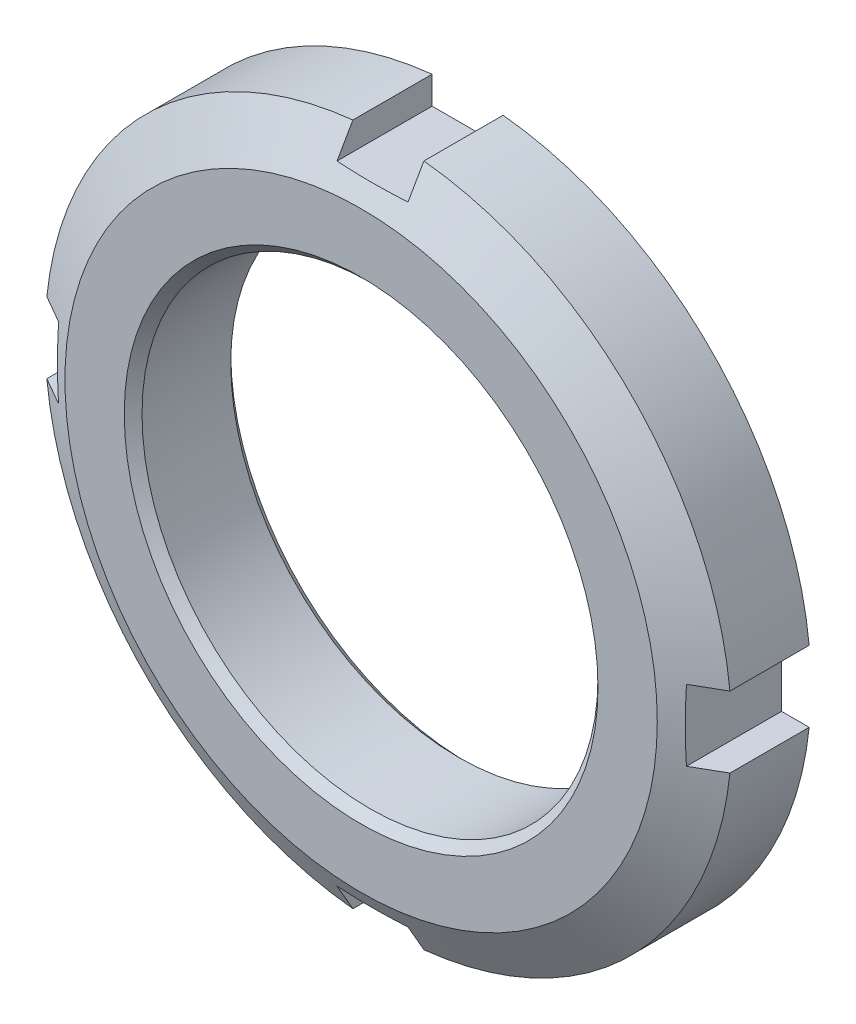
ISO-10303-21;
HEADER;
FILE_DESCRIPTION(('STEP AP214'),'2;1');
FILE_NAME('part.step','',(''),(''),'','','');
FILE_SCHEMA(('AUTOMOTIVE_DESIGN { 1 0 10303 214 1 1 1 1 }'));
ENDSEC;
DATA;
#1=APPLICATION_CONTEXT('core data for automotive mechanical design processes');
#2=APPLICATION_PROTOCOL_DEFINITION('international standard','automotive_design',2000,#1);
#3=PRODUCT_CONTEXT('',#1,'mechanical');
#4=PRODUCT('Part','Part','',(#3));
#5=PRODUCT_RELATED_PRODUCT_CATEGORY('part','',(#4));
#6=PRODUCT_DEFINITION_FORMATION('','',#4);
#7=PRODUCT_DEFINITION_CONTEXT('part definition',#1,'design');
#8=PRODUCT_DEFINITION('design','',#6,#7);
#9=PRODUCT_DEFINITION_SHAPE('','',#8);
#10=(LENGTH_UNIT() NAMED_UNIT(*) SI_UNIT(.MILLI.,.METRE.));
#11=(NAMED_UNIT(*) PLANE_ANGLE_UNIT() SI_UNIT($,.RADIAN.));
#12=(NAMED_UNIT(*) SI_UNIT($,.STERADIAN.) SOLID_ANGLE_UNIT());
#13=UNCERTAINTY_MEASURE_WITH_UNIT(LENGTH_MEASURE(1.E-05),#10,'distance_accuracy_value','');
#14=(GEOMETRIC_REPRESENTATION_CONTEXT(3) GLOBAL_UNCERTAINTY_ASSIGNED_CONTEXT((#13)) GLOBAL_UNIT_ASSIGNED_CONTEXT((#10,
#11,#12)) REPRESENTATION_CONTEXT('',''));
#15=CARTESIAN_POINT('',(0.,0.,0.));
#16=DIRECTION('',(0.,0.,1.));
#17=DIRECTION('',(1.,0.,0.));
#18=AXIS2_PLACEMENT_3D('',#15,#16,#17);
#19=CARTESIAN_POINT('',(0.,0.,7.8404212982628));
#20=DIRECTION('',(0.,0.,-1.));
#21=DIRECTION('',(-1.,0.,0.));
#22=AXIS2_PLACEMENT_3D('',#19,#20,#21);
#23=CONICAL_SURFACE('',#22,27.0002,1.0471975511966);
#24=CARTESIAN_POINT('',(2.9972,-26.5049,8.0288540819859));
#25=CARTESIAN_POINT('',(2.9972,-27.6231961592664,7.38729437410009));
#26=CARTESIAN_POINT('',(2.9972,-28.8387695120648,6.6892425965256));
#27=(BOUNDED_CURVE() B_SPLINE_CURVE(2,(#24,#25,#26),.UNSPECIFIED.,.F.,
.F.) B_SPLINE_CURVE_WITH_KNOTS((3,3),(0.,0.269100462883302),
.UNSPECIFIED.) CURVE() GEOMETRIC_REPRESENTATION_ITEM() RATIONAL_B_SPLINE_CURVE((1.,
1.00088000690833,1.)) REPRESENTATION_ITEM(''));
#28=CARTESIAN_POINT('',(2.9972,-26.5049,8.0288540819859));
#29=VERTEX_POINT('',#28);
#30=CARTESIAN_POINT('',(2.9972,-28.8387695120648,6.6892425965256));
#31=VERTEX_POINT('',#30);
#32=EDGE_CURVE('E220',#29,#31,#27,.T.);
#33=ORIENTED_EDGE('',*,*,#32,.T.);
#34=CARTESIAN_POINT('',(0.,0.,6.6892425965256));
#35=DIRECTION('',(0.,0.,-1.));
#36=DIRECTION('',(-1.,0.,0.));
#37=AXIS2_PLACEMENT_3D('',#34,#35,#36);
#38=CIRCLE('',#37,28.9941);
#39=CARTESIAN_POINT('',(28.8387695120648,-2.9972,6.6892425965256));
#40=VERTEX_POINT('',#39);
#41=EDGE_CURVE('E215',#40,#31,#38,.T.);
#42=ORIENTED_EDGE('',*,*,#41,.F.);
#43=CARTESIAN_POINT('',(28.8387695120648,-2.9972,6.6892425965256));
#44=CARTESIAN_POINT('',(27.6231961589663,-2.99720000000001,7.38729437427234));
#45=CARTESIAN_POINT('',(26.5049,-2.9972,8.0288540819859));
#46=(BOUNDED_CURVE() B_SPLINE_CURVE(2,(#43,#44,#45),.UNSPECIFIED.,.F.,
.F.) B_SPLINE_CURVE_WITH_KNOTS((3,3),(0.,0.269100462883301),
.UNSPECIFIED.) CURVE() GEOMETRIC_REPRESENTATION_ITEM() RATIONAL_B_SPLINE_CURVE((1.,
1.00088000691499,1.)) REPRESENTATION_ITEM(''));
#47=CARTESIAN_POINT('',(26.5049,-2.9972,8.0288540819859));
#48=VERTEX_POINT('',#47);
#49=EDGE_CURVE('E219',#40,#48,#46,.T.);
#50=ORIENTED_EDGE('',*,*,#49,.T.);
#51=CARTESIAN_POINT('',(26.5049,-2.99720000000001,8.0288540819859));
#52=CARTESIAN_POINT('',(26.5049000000001,-1.49383962311759,8.12638288659241));
#53=CARTESIAN_POINT('',(26.5049000000001,0.,8.12638288659242));
#54=(BOUNDED_CURVE() B_SPLINE_CURVE(2,(#51,#52,#53),.UNSPECIFIED.,.F.,
.F.) B_SPLINE_CURVE_WITH_KNOTS((3,3),(0.868990916603117,1.18411774335719),
.UNSPECIFIED.) CURVE() GEOMETRIC_REPRESENTATION_ITEM() RATIONAL_B_SPLINE_CURVE((1.04363164333091,
1.0469573550551,1.0469573550551)) REPRESENTATION_ITEM(''));
#55=CARTESIAN_POINT('',(26.5049,0.,8.12638288659242));
#56=VERTEX_POINT('',#55);
#57=EDGE_CURVE('E323',#48,#56,#54,.T.);
#58=ORIENTED_EDGE('',*,*,#57,.T.);
#59=DIRECTION('',(-0.866025403784438,0.,0.5));
#60=VECTOR('',#59,1.);
#61=CARTESIAN_POINT('',(27.0002,0.,7.84042129826279));
#62=LINE('',#61,#60);
#63=CARTESIAN_POINT('',(25.0063,0.,8.9916));
#64=VERTEX_POINT('',#63);
#65=EDGE_CURVE('E11',#56,#64,#62,.T.);
#66=ORIENTED_EDGE('',*,*,#65,.T.);
#67=CARTESIAN_POINT('',(0.,0.,8.9916));
#68=DIRECTION('',(0.,0.,-1.));
#69=DIRECTION('',(-1.,0.,0.));
#70=AXIS2_PLACEMENT_3D('',#67,#68,#69);
#71=CIRCLE('',#70,25.0063);
#72=EDGE_CURVE('E259',#64,#64,#71,.T.);
#73=ORIENTED_EDGE('',*,*,#72,.T.);
#74=ORIENTED_EDGE('',*,*,#65,.F.);
#75=CARTESIAN_POINT('',(26.5049000000001,0.,8.12638288659242));
#76=CARTESIAN_POINT('',(26.5049000000001,1.49383962311758,8.12638288659242));
#77=CARTESIAN_POINT('',(26.5049,2.99719999999999,8.0288540819859));
#78=(BOUNDED_CURVE() B_SPLINE_CURVE(2,(#75,#76,#77),.UNSPECIFIED.,.F.,
.F.) B_SPLINE_CURVE_WITH_KNOTS((3,3),(1.18411774335719,1.49924457011127),
.UNSPECIFIED.) CURVE() GEOMETRIC_REPRESENTATION_ITEM() RATIONAL_B_SPLINE_CURVE((1.0469573550551,
1.0469573550551,1.04363164333091)) REPRESENTATION_ITEM(''));
#79=CARTESIAN_POINT('',(26.5049,2.9972,8.0288540819859));
#80=VERTEX_POINT('',#79);
#81=EDGE_CURVE('E331',#56,#80,#78,.T.);
#82=ORIENTED_EDGE('',*,*,#81,.T.);
#83=CARTESIAN_POINT('',(26.5049,2.9972,8.0288540819859));
#84=CARTESIAN_POINT('',(27.6231961589611,2.99719999999999,7.38729437427535));
#85=CARTESIAN_POINT('',(28.8387695120648,2.9972,6.68924259652559));
#86=(BOUNDED_CURVE() B_SPLINE_CURVE(2,(#83,#84,#85),.UNSPECIFIED.,.F.,
.F.) B_SPLINE_CURVE_WITH_KNOTS((3,3),(0.,0.269100462883302),
.UNSPECIFIED.) CURVE() GEOMETRIC_REPRESENTATION_ITEM() RATIONAL_B_SPLINE_CURVE((1.,
1.00088000684667,1.)) REPRESENTATION_ITEM(''));
#87=CARTESIAN_POINT('',(28.8387695120648,2.9972,6.6892425965256));
#88=VERTEX_POINT('',#87);
#89=EDGE_CURVE('E420',#80,#88,#86,.T.);
#90=ORIENTED_EDGE('',*,*,#89,.T.);
#91=CARTESIAN_POINT('',(0.,0.,6.6892425965256));
#92=DIRECTION('',(0.,0.,-1.));
#93=DIRECTION('',(-1.,0.,0.));
#94=AXIS2_PLACEMENT_3D('',#91,#92,#93);
#95=CIRCLE('',#94,28.9941);
#96=CARTESIAN_POINT('',(2.9972,28.8387695120648,6.6892425965256));
#97=VERTEX_POINT('',#96);
#98=EDGE_CURVE('E207',#97,#88,#95,.T.);
#99=ORIENTED_EDGE('',*,*,#98,.F.);
#100=CARTESIAN_POINT('',(2.9972,28.8387695120648,6.6892425965256));
#101=CARTESIAN_POINT('',(2.9972,27.6231961598609,7.38729437375896));
#102=CARTESIAN_POINT('',(2.9972,26.5049,8.0288540819859));
#103=(BOUNDED_CURVE() B_SPLINE_CURVE(2,(#100,#101,#102),.UNSPECIFIED.,.F.,
.F.) B_SPLINE_CURVE_WITH_KNOTS((3,3),(0.,0.260699242565924),
.UNSPECIFIED.) CURVE() GEOMETRIC_REPRESENTATION_ITEM() RATIONAL_B_SPLINE_CURVE((1.,
1.00156229891824,1.00136384903368)) REPRESENTATION_ITEM(''));
#104=CARTESIAN_POINT('',(2.9972,26.5049,8.0288540819859));
#105=VERTEX_POINT('',#104);
#106=EDGE_CURVE('E317',#97,#105,#103,.T.);
#107=ORIENTED_EDGE('',*,*,#106,.T.);
#108=CARTESIAN_POINT('',(2.9972,26.5049,8.0288540819859));
#109=CARTESIAN_POINT('',(0.,26.5049,8.22329404306352));
#110=CARTESIAN_POINT('',(-2.9972,26.5049,8.0288540819859));
#111=(BOUNDED_CURVE() B_SPLINE_CURVE(2,(#108,#109,#110),.UNSPECIFIED.,.F.,
.F.) B_SPLINE_CURVE_WITH_KNOTS((3,3),(0.868990916603121,1.49924457011127),
.UNSPECIFIED.) CURVE() GEOMETRIC_REPRESENTATION_ITEM() RATIONAL_B_SPLINE_CURVE((1.04363164333091,
1.05028306677929,1.04363164333091)) REPRESENTATION_ITEM(''));
#112=CARTESIAN_POINT('',(-2.9972,26.5049,8.0288540819859));
#113=VERTEX_POINT('',#112);
#114=EDGE_CURVE('E28',#105,#113,#111,.T.);
#115=ORIENTED_EDGE('',*,*,#114,.T.);
#116=CARTESIAN_POINT('',(-2.9972,26.5049,8.0288540819859));
#117=CARTESIAN_POINT('',(-2.9972,27.6231961598645,7.38729437375686));
#118=CARTESIAN_POINT('',(-2.9972,28.8387695120648,6.6892425965256));
#119=(BOUNDED_CURVE() B_SPLINE_CURVE(2,(#116,#117,#118),.UNSPECIFIED.,.F.,
.F.) B_SPLINE_CURVE_WITH_KNOTS((3,3),(0.201933637262587,0.462632879828447),
.UNSPECIFIED.) CURVE() GEOMETRIC_REPRESENTATION_ITEM() RATIONAL_B_SPLINE_CURVE((1.00136384903057,
1.00156229891468,1.)) REPRESENTATION_ITEM(''));
#120=CARTESIAN_POINT('',(-2.9972,28.8387695120648,6.6892425965256));
#121=VERTEX_POINT('',#120);
#122=EDGE_CURVE('E224',#113,#121,#119,.T.);
#123=ORIENTED_EDGE('',*,*,#122,.T.);
#124=CARTESIAN_POINT('',(0.,0.,6.6892425965256));
#125=DIRECTION('',(0.,0.,-1.));
#126=DIRECTION('',(-1.,0.,0.));
#127=AXIS2_PLACEMENT_3D('',#124,#125,#126);
#128=CIRCLE('',#127,28.9941);
#129=CARTESIAN_POINT('',(-28.8387695120648,2.9972,6.6892425965256));
#130=VERTEX_POINT('',#129);
#131=EDGE_CURVE('E291',#130,#121,#128,.T.);
#132=ORIENTED_EDGE('',*,*,#131,.F.);
#133=CARTESIAN_POINT('',(-28.8387695120649,2.9972,6.6892425965256));
#134=CARTESIAN_POINT('',(-27.6231961589663,2.99719999999999,7.38729437427234));
#135=CARTESIAN_POINT('',(-26.5049,2.9972,8.0288540819859));
#136=(BOUNDED_CURVE() B_SPLINE_CURVE(2,(#133,#134,#135),.UNSPECIFIED.,.F.,
.F.) B_SPLINE_CURVE_WITH_KNOTS((3,3),(0.,0.269100462883301),
.UNSPECIFIED.) CURVE() GEOMETRIC_REPRESENTATION_ITEM() RATIONAL_B_SPLINE_CURVE((1.,
1.00088000690338,1.)) REPRESENTATION_ITEM(''));
#137=CARTESIAN_POINT('',(-26.5049,2.9972,8.0288540819859));
#138=VERTEX_POINT('',#137);
#139=EDGE_CURVE('E314',#130,#138,#136,.T.);
#140=ORIENTED_EDGE('',*,*,#139,.T.);
#141=CARTESIAN_POINT('',(-26.5049,2.99719999999999,8.0288540819859));
#142=CARTESIAN_POINT('',(-26.5049,0.,8.22329404306352));
#143=CARTESIAN_POINT('',(-26.5049,-2.99720000000001,8.0288540819859));
#144=(BOUNDED_CURVE() B_SPLINE_CURVE(2,(#141,#142,#143),.UNSPECIFIED.,.F.,
.F.) B_SPLINE_CURVE_WITH_KNOTS((3,3),(0.868990916603124,1.49924457011128),
.UNSPECIFIED.) CURVE() GEOMETRIC_REPRESENTATION_ITEM() RATIONAL_B_SPLINE_CURVE((1.04363164333091,
1.0502830667793,1.04363164333091)) REPRESENTATION_ITEM(''));
#145=CARTESIAN_POINT('',(-26.5049,-2.9972,8.0288540819859));
#146=VERTEX_POINT('',#145);
#147=EDGE_CURVE('E167',#138,#146,#144,.T.);
#148=ORIENTED_EDGE('',*,*,#147,.T.);
#149=CARTESIAN_POINT('',(-26.5049,-2.9972,8.0288540819859));
#150=CARTESIAN_POINT('',(-27.623196158965,-2.99720000000001,7.38729437427309));
#151=CARTESIAN_POINT('',(-28.8387695120648,-2.9972,6.6892425965256));
#152=(BOUNDED_CURVE() B_SPLINE_CURVE(2,(#149,#150,#151),.UNSPECIFIED.,.F.,
.F.) B_SPLINE_CURVE_WITH_KNOTS((3,3),(0.,0.269100462883302),
.UNSPECIFIED.) CURVE() GEOMETRIC_REPRESENTATION_ITEM() RATIONAL_B_SPLINE_CURVE((1.,
1.00088000695072,1.)) REPRESENTATION_ITEM(''));
#153=CARTESIAN_POINT('',(-28.8387695120648,-2.9972,6.6892425965256));
#154=VERTEX_POINT('',#153);
#155=EDGE_CURVE('E272',#146,#154,#152,.T.);
#156=ORIENTED_EDGE('',*,*,#155,.T.);
#157=CARTESIAN_POINT('',(0.,0.,6.6892425965256));
#158=DIRECTION('',(0.,0.,-1.));
#159=DIRECTION('',(-1.,0.,0.));
#160=AXIS2_PLACEMENT_3D('',#157,#158,#159);
#161=CIRCLE('',#160,28.9941);
#162=CARTESIAN_POINT('',(-2.9972,-28.8387695120648,6.6892425965256));
#163=VERTEX_POINT('',#162);
#164=EDGE_CURVE('E178',#163,#154,#161,.T.);
#165=ORIENTED_EDGE('',*,*,#164,.F.);
#166=CARTESIAN_POINT('',(-2.9972,-28.8387695120648,6.6892425965256));
#167=CARTESIAN_POINT('',(-2.9972,-27.6231961596848,7.38729437385992));
#168=CARTESIAN_POINT('',(-2.9972,-26.5049,8.0288540819859));
#169=(BOUNDED_CURVE() B_SPLINE_CURVE(2,(#166,#167,#168),.UNSPECIFIED.,.F.,
.F.) B_SPLINE_CURVE_WITH_KNOTS((3,3),(0.,0.269100462883301),
.UNSPECIFIED.) CURVE() GEOMETRIC_REPRESENTATION_ITEM() RATIONAL_B_SPLINE_CURVE((1.,
1.00088000687904,1.)) REPRESENTATION_ITEM(''));
#170=CARTESIAN_POINT('',(-2.9972,-26.5049,8.0288540819859));
#171=VERTEX_POINT('',#170);
#172=EDGE_CURVE('E338',#163,#171,#169,.T.);
#173=ORIENTED_EDGE('',*,*,#172,.T.);
#174=CARTESIAN_POINT('',(-2.9972,-26.5049,8.0288540819859));
#175=CARTESIAN_POINT('',(0.,-26.5049,8.22329404306352));
#176=CARTESIAN_POINT('',(2.9972,-26.5049,8.0288540819859));
#177=(BOUNDED_CURVE() B_SPLINE_CURVE(2,(#174,#175,#176),.UNSPECIFIED.,.F.,
.F.) B_SPLINE_CURVE_WITH_KNOTS((3,3),(0.868990916603121,1.49924457011127),
.UNSPECIFIED.) CURVE() GEOMETRIC_REPRESENTATION_ITEM() RATIONAL_B_SPLINE_CURVE((1.04363164333091,
1.05028306677929,1.04363164333091)) REPRESENTATION_ITEM(''));
#178=EDGE_CURVE('E345',#171,#29,#177,.T.);
#179=ORIENTED_EDGE('',*,*,#178,.T.);
#180=EDGE_LOOP('',(#33,#42,#50,#58,#66,#73,#74,#82,#90,#99,#107,#115,#123,#132,#140,#148,#156,
#165,#173,#179));
#181=FACE_BOUND('',#180,.T.);
#182=ADVANCED_FACE('F17',(#181),#23,.T.);
#183=CARTESIAN_POINT('',(2.9972,26.5049,0.));
#184=DIRECTION('',(0.,-1.,0.));
#185=DIRECTION('',(0.,0.,-1.));
#186=AXIS2_PLACEMENT_3D('',#183,#184,#185);
#187=PLANE('',#186);
#188=ORIENTED_EDGE('',*,*,#114,.F.);
#189=DIRECTION('',(0.,0.,1.));
#190=VECTOR('',#189,1.);
#191=CARTESIAN_POINT('',(2.9972,26.5049,0.));
#192=LINE('',#191,#190);
#193=CARTESIAN_POINT('',(2.9972,26.5049,0.));
#194=VERTEX_POINT('',#193);
#195=EDGE_CURVE('E21',#194,#105,#192,.T.);
#196=ORIENTED_EDGE('',*,*,#195,.F.);
#197=DIRECTION('',(1.,0.,0.));
#198=VECTOR('',#197,1.);
#199=CARTESIAN_POINT('',(-10.562425,26.5049,0.));
#200=LINE('',#199,#198);
#201=CARTESIAN_POINT('',(-2.9972,26.5049,0.));
#202=VERTEX_POINT('',#201);
#203=EDGE_CURVE('E262',#202,#194,#200,.T.);
#204=ORIENTED_EDGE('',*,*,#203,.F.);
#205=DIRECTION('',(0.,0.,1.));
#206=VECTOR('',#205,1.);
#207=CARTESIAN_POINT('',(-2.9972,26.5049,0.));
#208=LINE('',#207,#206);
#209=EDGE_CURVE('E290',#202,#113,#208,.T.);
#210=ORIENTED_EDGE('',*,*,#209,.T.);
#211=EDGE_LOOP('',(#188,#196,#204,#210));
#212=FACE_BOUND('',#211,.T.);
#213=ADVANCED_FACE('F503',(#212),#187,.F.);
#214=CARTESIAN_POINT('',(2.9972,28.9941,0.));
#215=DIRECTION('',(1.,0.,0.));
#216=DIRECTION('',(0.,1.,0.));
#217=AXIS2_PLACEMENT_3D('',#214,#215,#216);
#218=PLANE('',#217);
#219=ORIENTED_EDGE('',*,*,#106,.F.);
#220=DIRECTION('',(0.,0.,1.));
#221=VECTOR('',#220,1.);
#222=CARTESIAN_POINT('',(2.9972,28.8387695120648,3.3446212982628));
#223=LINE('',#222,#221);
#224=CARTESIAN_POINT('',(2.9972,28.8387695120648,0.));
#225=VERTEX_POINT('',#224);
#226=EDGE_CURVE('E383',#225,#97,#223,.T.);
#227=ORIENTED_EDGE('',*,*,#226,.F.);
#228=DIRECTION('',(0.,1.,0.));
#229=VECTOR('',#228,1.);
#230=CARTESIAN_POINT('',(2.9972,14.49705,0.));
#231=LINE('',#230,#229);
#232=EDGE_CURVE('E266',#194,#225,#231,.T.);
#233=ORIENTED_EDGE('',*,*,#232,.F.);
#234=ORIENTED_EDGE('',*,*,#195,.T.);
#235=EDGE_LOOP('',(#219,#227,#233,#234));
#236=FACE_BOUND('',#235,.T.);
#237=ADVANCED_FACE('F464',(#236),#218,.F.);
#238=CARTESIAN_POINT('',(-2.9972,26.5049,0.));
#239=DIRECTION('',(-1.,0.,0.));
#240=DIRECTION('',(0.,0.,1.));
#241=AXIS2_PLACEMENT_3D('',#238,#239,#240);
#242=PLANE('',#241);
#243=ORIENTED_EDGE('',*,*,#122,.F.);
#244=ORIENTED_EDGE('',*,*,#209,.F.);
#245=DIRECTION('',(0.,-1.,0.));
#246=VECTOR('',#245,1.);
#247=CARTESIAN_POINT('',(-2.9972,13.25245,0.));
#248=LINE('',#247,#246);
#249=CARTESIAN_POINT('',(-2.9972,28.8387695120648,0.));
#250=VERTEX_POINT('',#249);
#251=EDGE_CURVE('E267',#250,#202,#248,.T.);
#252=ORIENTED_EDGE('',*,*,#251,.F.);
#253=DIRECTION('',(0.,0.,-1.));
#254=VECTOR('',#253,1.);
#255=CARTESIAN_POINT('',(-2.9972,28.8387695120648,3.3446212982628));
#256=LINE('',#255,#254);
#257=EDGE_CURVE('E298',#121,#250,#256,.T.);
#258=ORIENTED_EDGE('',*,*,#257,.F.);
#259=EDGE_LOOP('',(#243,#244,#252,#258));
#260=FACE_BOUND('',#259,.T.);
#261=ADVANCED_FACE('F772',(#260),#242,.F.);
#262=CARTESIAN_POINT('',(0.,0.,3.3446212982628));
#263=DIRECTION('',(0.,0.,-1.));
#264=DIRECTION('',(-1.,0.,0.));
#265=AXIS2_PLACEMENT_3D('',#262,#263,#264);
#266=CYLINDRICAL_SURFACE('',#265,28.9941);
#267=DIRECTION('',(0.,0.,-1.));
#268=VECTOR('',#267,1.);
#269=CARTESIAN_POINT('',(2.9972,-28.8387695120648,3.3446212982628));
#270=LINE('',#269,#268);
#271=CARTESIAN_POINT('',(2.9972,-28.8387695120648,0.));
#272=VERTEX_POINT('',#271);
#273=EDGE_CURVE('E332',#31,#272,#270,.T.);
#274=ORIENTED_EDGE('',*,*,#273,.T.);
#275=CARTESIAN_POINT('',(0.,0.,0.));
#276=DIRECTION('',(0.,0.,-1.));
#277=DIRECTION('',(-1.,0.,0.));
#278=AXIS2_PLACEMENT_3D('',#275,#276,#277);
#279=CIRCLE('',#278,28.9941);
#280=CARTESIAN_POINT('',(28.8387695120648,-2.9972,0.));
#281=VERTEX_POINT('',#280);
#282=EDGE_CURVE('E230',#281,#272,#279,.T.);
#283=ORIENTED_EDGE('',*,*,#282,.F.);
#284=DIRECTION('',(0.,0.,1.));
#285=VECTOR('',#284,1.);
#286=CARTESIAN_POINT('',(28.8387695120648,-2.9972,3.34462129826279));
#287=LINE('',#286,#285);
#288=EDGE_CURVE('E227',#281,#40,#287,.T.);
#289=ORIENTED_EDGE('',*,*,#288,.T.);
#290=ORIENTED_EDGE('',*,*,#41,.T.);
#291=EDGE_LOOP('',(#274,#283,#289,#290));
#292=FACE_BOUND('',#291,.T.);
#293=ADVANCED_FACE('F228',(#292),#266,.T.);
#294=CARTESIAN_POINT('',(0.,0.,3.3446212982628));
#295=DIRECTION('',(0.,0.,-1.));
#296=DIRECTION('',(-1.,0.,0.));
#297=AXIS2_PLACEMENT_3D('',#294,#295,#296);
#298=CYLINDRICAL_SURFACE('',#297,28.9941);
#299=DIRECTION('',(0.,0.,1.));
#300=VECTOR('',#299,1.);
#301=CARTESIAN_POINT('',(-2.9972,-28.8387695120648,3.3446212982628));
#302=LINE('',#301,#300);
#303=CARTESIAN_POINT('',(-2.9972,-28.8387695120648,0.));
#304=VERTEX_POINT('',#303);
#305=EDGE_CURVE('E344',#304,#163,#302,.T.);
#306=ORIENTED_EDGE('',*,*,#305,.T.);
#307=ORIENTED_EDGE('',*,*,#164,.T.);
#308=DIRECTION('',(0.,0.,-1.));
#309=VECTOR('',#308,1.);
#310=CARTESIAN_POINT('',(-28.8387695120648,-2.9972,3.34462129826281));
#311=LINE('',#310,#309);
#312=CARTESIAN_POINT('',(-28.8387695120648,-2.9972,0.));
#313=VERTEX_POINT('',#312);
#314=EDGE_CURVE('E271',#154,#313,#311,.T.);
#315=ORIENTED_EDGE('',*,*,#314,.T.);
#316=CARTESIAN_POINT('',(0.,0.,0.));
#317=DIRECTION('',(0.,0.,-1.));
#318=DIRECTION('',(-1.,0.,0.));
#319=AXIS2_PLACEMENT_3D('',#316,#317,#318);
#320=CIRCLE('',#319,28.9941);
#321=EDGE_CURVE('E371',#304,#313,#320,.T.);
#322=ORIENTED_EDGE('',*,*,#321,.F.);
#323=EDGE_LOOP('',(#306,#307,#315,#322));
#324=FACE_BOUND('',#323,.T.);
#325=ADVANCED_FACE('F544',(#324),#298,.T.);
#326=CARTESIAN_POINT('',(0.,0.,3.3446212982628));
#327=DIRECTION('',(0.,0.,-1.));
#328=DIRECTION('',(-1.,0.,0.));
#329=AXIS2_PLACEMENT_3D('',#326,#327,#328);
#330=CYLINDRICAL_SURFACE('',#329,28.9941);
#331=DIRECTION('',(0.,0.,1.));
#332=VECTOR('',#331,1.);
#333=CARTESIAN_POINT('',(-28.8387695120648,2.9972,3.34462129826281));
#334=LINE('',#333,#332);
#335=CARTESIAN_POINT('',(-28.8387695120648,2.9972,0.));
#336=VERTEX_POINT('',#335);
#337=EDGE_CURVE('E306',#336,#130,#334,.T.);
#338=ORIENTED_EDGE('',*,*,#337,.T.);
#339=ORIENTED_EDGE('',*,*,#131,.T.);
#340=ORIENTED_EDGE('',*,*,#257,.T.);
#341=CARTESIAN_POINT('',(0.,0.,0.));
#342=DIRECTION('',(0.,0.,-1.));
#343=DIRECTION('',(-1.,0.,0.));
#344=AXIS2_PLACEMENT_3D('',#341,#342,#343);
#345=CIRCLE('',#344,28.9941);
#346=EDGE_CURVE('E276',#336,#250,#345,.T.);
#347=ORIENTED_EDGE('',*,*,#346,.F.);
#348=EDGE_LOOP('',(#338,#339,#340,#347));
#349=FACE_BOUND('',#348,.T.);
#350=ADVANCED_FACE('F762',(#349),#330,.T.);
#351=CARTESIAN_POINT('',(0.,0.,3.3446212982628));
#352=DIRECTION('',(0.,0.,-1.));
#353=DIRECTION('',(-1.,0.,0.));
#354=AXIS2_PLACEMENT_3D('',#351,#352,#353);
#355=CYLINDRICAL_SURFACE('',#354,28.9941);
#356=DIRECTION('',(0.,0.,-1.));
#357=VECTOR('',#356,1.);
#358=CARTESIAN_POINT('',(28.8387695120648,2.9972,3.34462129826279));
#359=LINE('',#358,#357);
#360=CARTESIAN_POINT('',(28.8387695120648,2.9972,0.));
#361=VERTEX_POINT('',#360);
#362=EDGE_CURVE('E241',#88,#361,#359,.T.);
#363=ORIENTED_EDGE('',*,*,#362,.T.);
#364=CARTESIAN_POINT('',(0.,0.,0.));
#365=DIRECTION('',(0.,0.,-1.));
#366=DIRECTION('',(-1.,0.,0.));
#367=AXIS2_PLACEMENT_3D('',#364,#365,#366);
#368=CIRCLE('',#367,28.9941);
#369=EDGE_CURVE('E410',#225,#361,#368,.T.);
#370=ORIENTED_EDGE('',*,*,#369,.F.);
#371=ORIENTED_EDGE('',*,*,#226,.T.);
#372=ORIENTED_EDGE('',*,*,#98,.T.);
#373=EDGE_LOOP('',(#363,#370,#371,#372));
#374=FACE_BOUND('',#373,.T.);
#375=ADVANCED_FACE('F19',(#374),#355,.T.);
#376=CARTESIAN_POINT('',(26.5049,-2.9972,0.));
#377=DIRECTION('',(-1.,0.,0.));
#378=DIRECTION('',(0.,0.,1.));
#379=AXIS2_PLACEMENT_3D('',#376,#377,#378);
#380=PLANE('',#379);
#381=ORIENTED_EDGE('',*,*,#57,.F.);
#382=DIRECTION('',(0.,0.,1.));
#383=VECTOR('',#382,1.);
#384=CARTESIAN_POINT('',(26.5049,-2.9972,0.));
#385=LINE('',#384,#383);
#386=CARTESIAN_POINT('',(26.5049,-2.9972,0.));
#387=VERTEX_POINT('',#386);
#388=EDGE_CURVE('E235',#387,#48,#385,.T.);
#389=ORIENTED_EDGE('',*,*,#388,.F.);
#390=DIRECTION('',(0.,-1.,0.));
#391=VECTOR('',#390,1.);
#392=CARTESIAN_POINT('',(26.5049,-1.4986,0.));
#393=LINE('',#392,#391);
#394=CARTESIAN_POINT('',(26.5049,2.9972,0.));
#395=VERTEX_POINT('',#394);
#396=EDGE_CURVE('E409',#395,#387,#393,.T.);
#397=ORIENTED_EDGE('',*,*,#396,.F.);
#398=DIRECTION('',(0.,0.,1.));
#399=VECTOR('',#398,1.);
#400=CARTESIAN_POINT('',(26.5049,2.9972,0.));
#401=LINE('',#400,#399);
#402=EDGE_CURVE('E247',#395,#80,#401,.T.);
#403=ORIENTED_EDGE('',*,*,#402,.T.);
#404=ORIENTED_EDGE('',*,*,#81,.F.);
#405=EDGE_LOOP('',(#381,#389,#397,#403,#404));
#406=FACE_BOUND('',#405,.T.);
#407=ADVANCED_FACE('F472',(#406),#380,.F.);
#408=CARTESIAN_POINT('',(28.9941,-2.9972,0.));
#409=DIRECTION('',(0.,-1.,0.));
#410=DIRECTION('',(-1.,0.,0.));
#411=AXIS2_PLACEMENT_3D('',#408,#409,#410);
#412=PLANE('',#411);
#413=ORIENTED_EDGE('',*,*,#49,.F.);
#414=ORIENTED_EDGE('',*,*,#288,.F.);
#415=DIRECTION('',(1.,0.,0.));
#416=VECTOR('',#415,1.);
#417=CARTESIAN_POINT('',(2.436025,-2.9972,0.));
#418=LINE('',#417,#416);
#419=EDGE_CURVE('E365',#387,#281,#418,.T.);
#420=ORIENTED_EDGE('',*,*,#419,.F.);
#421=ORIENTED_EDGE('',*,*,#388,.T.);
#422=EDGE_LOOP('',(#413,#414,#420,#421));
#423=FACE_BOUND('',#422,.T.);
#424=ADVANCED_FACE('F238',(#423),#412,.F.);
#425=CARTESIAN_POINT('',(26.5049,2.9972,0.));
#426=DIRECTION('',(0.,1.,0.));
#427=DIRECTION('',(1.,0.,0.));
#428=AXIS2_PLACEMENT_3D('',#425,#426,#427);
#429=PLANE('',#428);
#430=ORIENTED_EDGE('',*,*,#89,.F.);
#431=ORIENTED_EDGE('',*,*,#402,.F.);
#432=DIRECTION('',(-1.,0.,0.));
#433=VECTOR('',#432,1.);
#434=CARTESIAN_POINT('',(1.191425,2.9972,0.));
#435=LINE('',#434,#433);
#436=EDGE_CURVE('E405',#361,#395,#435,.T.);
#437=ORIENTED_EDGE('',*,*,#436,.F.);
#438=ORIENTED_EDGE('',*,*,#362,.F.);
#439=EDGE_LOOP('',(#430,#431,#437,#438));
#440=FACE_BOUND('',#439,.T.);
#441=ADVANCED_FACE('F469',(#440),#429,.F.);
#442=CARTESIAN_POINT('',(-26.5049,2.9972,0.));
#443=DIRECTION('',(1.,0.,0.));
#444=DIRECTION('',(0.,1.,0.));
#445=AXIS2_PLACEMENT_3D('',#442,#443,#444);
#446=PLANE('',#445);
#447=ORIENTED_EDGE('',*,*,#147,.F.);
#448=DIRECTION('',(0.,0.,1.));
#449=VECTOR('',#448,1.);
#450=CARTESIAN_POINT('',(-26.5049,2.9972,0.));
#451=LINE('',#450,#449);
#452=CARTESIAN_POINT('',(-26.5049,2.9972,0.));
#453=VERTEX_POINT('',#452);
#454=EDGE_CURVE('E313',#453,#138,#451,.T.);
#455=ORIENTED_EDGE('',*,*,#454,.F.);
#456=DIRECTION('',(0.,1.,0.));
#457=VECTOR('',#456,1.);
#458=CARTESIAN_POINT('',(-26.5049,1.4986,0.));
#459=LINE('',#458,#457);
#460=CARTESIAN_POINT('',(-26.5049,-2.9972,0.));
#461=VERTEX_POINT('',#460);
#462=EDGE_CURVE('E370',#461,#453,#459,.T.);
#463=ORIENTED_EDGE('',*,*,#462,.F.);
#464=DIRECTION('',(0.,0.,1.));
#465=VECTOR('',#464,1.);
#466=CARTESIAN_POINT('',(-26.5049,-2.9972,0.));
#467=LINE('',#466,#465);
#468=EDGE_CURVE('E268',#461,#146,#467,.T.);
#469=ORIENTED_EDGE('',*,*,#468,.T.);
#470=EDGE_LOOP('',(#447,#455,#463,#469));
#471=FACE_BOUND('',#470,.T.);
#472=ADVANCED_FACE('F536',(#471),#446,.F.);
#473=CARTESIAN_POINT('',(-28.9941,2.9972,0.));
#474=DIRECTION('',(0.,1.,0.));
#475=DIRECTION('',(1.,0.,0.));
#476=AXIS2_PLACEMENT_3D('',#473,#474,#475);
#477=PLANE('',#476);
#478=ORIENTED_EDGE('',*,*,#139,.F.);
#479=ORIENTED_EDGE('',*,*,#337,.F.);
#480=DIRECTION('',(-1.,0.,0.));
#481=VECTOR('',#480,1.);
#482=CARTESIAN_POINT('',(-26.558075,2.9972,0.));
#483=LINE('',#482,#481);
#484=EDGE_CURVE('E280',#453,#336,#483,.T.);
#485=ORIENTED_EDGE('',*,*,#484,.F.);
#486=ORIENTED_EDGE('',*,*,#454,.T.);
#487=EDGE_LOOP('',(#478,#479,#485,#486));
#488=FACE_BOUND('',#487,.T.);
#489=ADVANCED_FACE('F528',(#488),#477,.F.);
#490=CARTESIAN_POINT('',(-26.5049,-2.9972,0.));
#491=DIRECTION('',(0.,-1.,0.));
#492=DIRECTION('',(0.,0.,-1.));
#493=AXIS2_PLACEMENT_3D('',#490,#491,#492);
#494=PLANE('',#493);
#495=ORIENTED_EDGE('',*,*,#155,.F.);
#496=ORIENTED_EDGE('',*,*,#468,.F.);
#497=DIRECTION('',(1.,0.,0.));
#498=VECTOR('',#497,1.);
#499=CARTESIAN_POINT('',(-25.313475,-2.9972,0.));
#500=LINE('',#499,#498);
#501=EDGE_CURVE('E366',#313,#461,#500,.T.);
#502=ORIENTED_EDGE('',*,*,#501,.F.);
#503=ORIENTED_EDGE('',*,*,#314,.F.);
#504=EDGE_LOOP('',(#495,#496,#502,#503));
#505=FACE_BOUND('',#504,.T.);
#506=ADVANCED_FACE('F526',(#505),#494,.F.);
#507=CARTESIAN_POINT('',(-2.9972,-26.5049,0.));
#508=DIRECTION('',(0.,1.,0.));
#509=DIRECTION('',(1.,0.,0.));
#510=AXIS2_PLACEMENT_3D('',#507,#508,#509);
#511=PLANE('',#510);
#512=ORIENTED_EDGE('',*,*,#178,.F.);
#513=DIRECTION('',(0.,0.,1.));
#514=VECTOR('',#513,1.);
#515=CARTESIAN_POINT('',(-2.9972,-26.5049,0.));
#516=LINE('',#515,#514);
#517=CARTESIAN_POINT('',(-2.9972,-26.5049,0.));
#518=VERTEX_POINT('',#517);
#519=EDGE_CURVE('E80',#518,#171,#516,.T.);
#520=ORIENTED_EDGE('',*,*,#519,.F.);
#521=DIRECTION('',(-1.,0.,0.));
#522=VECTOR('',#521,1.);
#523=CARTESIAN_POINT('',(-13.559625,-26.5049,0.));
#524=LINE('',#523,#522);
#525=CARTESIAN_POINT('',(2.9972,-26.5049,0.));
#526=VERTEX_POINT('',#525);
#527=EDGE_CURVE('E575',#526,#518,#524,.T.);
#528=ORIENTED_EDGE('',*,*,#527,.F.);
#529=DIRECTION('',(0.,0.,1.));
#530=VECTOR('',#529,1.);
#531=CARTESIAN_POINT('',(2.9972,-26.5049,0.));
#532=LINE('',#531,#530);
#533=EDGE_CURVE('E97',#526,#29,#532,.T.);
#534=ORIENTED_EDGE('',*,*,#533,.T.);
#535=EDGE_LOOP('',(#512,#520,#528,#534));
#536=FACE_BOUND('',#535,.T.);
#537=ADVANCED_FACE('F517',(#536),#511,.F.);
#538=CARTESIAN_POINT('',(-2.9972,-28.9941,0.));
#539=DIRECTION('',(-1.,0.,0.));
#540=DIRECTION('',(0.,0.,1.));
#541=AXIS2_PLACEMENT_3D('',#538,#539,#540);
#542=PLANE('',#541);
#543=ORIENTED_EDGE('',*,*,#172,.F.);
#544=ORIENTED_EDGE('',*,*,#305,.F.);
#545=DIRECTION('',(0.,-1.,0.));
#546=VECTOR('',#545,1.);
#547=CARTESIAN_POINT('',(-2.9972,-14.49705,0.));
#548=LINE('',#547,#546);
#549=EDGE_CURVE('E547',#518,#304,#548,.T.);
#550=ORIENTED_EDGE('',*,*,#549,.F.);
#551=ORIENTED_EDGE('',*,*,#519,.T.);
#552=EDGE_LOOP('',(#543,#544,#550,#551));
#553=FACE_BOUND('',#552,.T.);
#554=ADVANCED_FACE('F513',(#553),#542,.F.);
#555=CARTESIAN_POINT('',(2.9972,-26.5049,0.));
#556=DIRECTION('',(1.,0.,0.));
#557=DIRECTION('',(0.,-1.,0.));
#558=AXIS2_PLACEMENT_3D('',#555,#556,#557);
#559=PLANE('',#558);
#560=ORIENTED_EDGE('',*,*,#32,.F.);
#561=ORIENTED_EDGE('',*,*,#533,.F.);
#562=DIRECTION('',(0.,1.,0.));
#563=VECTOR('',#562,1.);
#564=CARTESIAN_POINT('',(2.9972,-13.25245,0.));
#565=LINE('',#564,#563);
#566=EDGE_CURVE('E446',#272,#526,#565,.T.);
#567=ORIENTED_EDGE('',*,*,#566,.F.);
#568=ORIENTED_EDGE('',*,*,#273,.F.);
#569=EDGE_LOOP('',(#560,#561,#567,#568));
#570=FACE_BOUND('',#569,.T.);
#571=ADVANCED_FACE('F516',(#570),#559,.F.);
#572=CARTESIAN_POINT('',(-22.12815,0.,8.9916));
#573=DIRECTION('',(0.,0.,1.));
#574=DIRECTION('',(1.,0.,0.));
#575=AXIS2_PLACEMENT_3D('',#572,#573,#574);
#576=PLANE('',#575);
#577=CARTESIAN_POINT('',(0.,0.,8.9916));
#578=DIRECTION('',(0.,0.,1.));
#579=DIRECTION('',(1.,0.,0.));
#580=AXIS2_PLACEMENT_3D('',#577,#578,#579);
#581=CIRCLE('',#580,20.);
#582=CARTESIAN_POINT('',(-20.,0.,8.9916));
#583=VERTEX_POINT('',#582);
#584=EDGE_CURVE('E260',#583,#583,#581,.T.);
#585=ORIENTED_EDGE('',*,*,#584,.F.);
#586=EDGE_LOOP('',(#585));
#587=FACE_BOUND('',#586,.T.);
#588=ORIENTED_EDGE('',*,*,#72,.F.);
#589=EDGE_LOOP('',(#588));
#590=FACE_BOUND('',#589,.T.);
#591=ADVANCED_FACE('F523',(#587,#590),#576,.T.);
#592=CARTESIAN_POINT('',(0.,0.,8.6166));
#593=DIRECTION('',(0.,0.,1.));
#594=DIRECTION('',(1.,0.,0.));
#595=AXIS2_PLACEMENT_3D('',#592,#593,#594);
#596=CONICAL_SURFACE('',#595,19.625,0.785398163397451);
#597=ORIENTED_EDGE('',*,*,#584,.T.);
#598=DIRECTION('',(0.707106781186549,0.,-0.707106781186546));
#599=VECTOR('',#598,1.);
#600=CARTESIAN_POINT('',(-19.625,0.,8.6166));
#601=LINE('',#600,#599);
#602=CARTESIAN_POINT('',(-19.25,0.,8.2416));
#603=VERTEX_POINT('',#602);
#604=EDGE_CURVE('E254',#583,#603,#601,.T.);
#605=ORIENTED_EDGE('',*,*,#604,.T.);
#606=CARTESIAN_POINT('',(0.,0.,8.2416));
#607=DIRECTION('',(0.,0.,-1.));
#608=DIRECTION('',(1.,0.,0.));
#609=AXIS2_PLACEMENT_3D('',#606,#607,#608);
#610=CIRCLE('',#609,19.25);
#611=CARTESIAN_POINT('',(19.25,0.,8.2416));
#612=VERTEX_POINT('',#611);
#613=EDGE_CURVE('E396',#603,#612,#610,.T.);
#614=ORIENTED_EDGE('',*,*,#613,.T.);
#615=CARTESIAN_POINT('',(0.,0.,8.2416));
#616=DIRECTION('',(0.,0.,-1.));
#617=DIRECTION('',(1.,0.,0.));
#618=AXIS2_PLACEMENT_3D('',#615,#616,#617);
#619=CIRCLE('',#618,19.25);
#620=EDGE_CURVE('E402',#612,#603,#619,.T.);
#621=ORIENTED_EDGE('',*,*,#620,.T.);
#622=ORIENTED_EDGE('',*,*,#604,.F.);
#623=EDGE_LOOP('',(#597,#605,#614,#621,#622));
#624=FACE_BOUND('',#623,.T.);
#625=ADVANCED_FACE('F521',(#624),#596,.F.);
#626=CARTESIAN_POINT('',(-24.12205,0.,0.));
#627=DIRECTION('',(0.,0.,-1.));
#628=DIRECTION('',(-1.,0.,0.));
#629=AXIS2_PLACEMENT_3D('',#626,#627,#628);
#630=PLANE('',#629);
#631=CARTESIAN_POINT('',(0.,0.,0.));
#632=DIRECTION('',(0.,0.,-1.));
#633=DIRECTION('',(1.,0.,0.));
#634=AXIS2_PLACEMENT_3D('',#631,#632,#633);
#635=CIRCLE('',#634,20.);
#636=CARTESIAN_POINT('',(-20.,0.,0.));
#637=VERTEX_POINT('',#636);
#638=EDGE_CURVE('E378',#637,#637,#635,.T.);
#639=ORIENTED_EDGE('',*,*,#638,.F.);
#640=EDGE_LOOP('',(#639));
#641=FACE_BOUND('',#640,.T.);
#642=ORIENTED_EDGE('',*,*,#566,.T.);
#643=ORIENTED_EDGE('',*,*,#527,.T.);
#644=ORIENTED_EDGE('',*,*,#549,.T.);
#645=ORIENTED_EDGE('',*,*,#321,.T.);
#646=ORIENTED_EDGE('',*,*,#501,.T.);
#647=ORIENTED_EDGE('',*,*,#462,.T.);
#648=ORIENTED_EDGE('',*,*,#484,.T.);
#649=ORIENTED_EDGE('',*,*,#346,.T.);
#650=ORIENTED_EDGE('',*,*,#251,.T.);
#651=ORIENTED_EDGE('',*,*,#203,.T.);
#652=ORIENTED_EDGE('',*,*,#232,.T.);
#653=ORIENTED_EDGE('',*,*,#369,.T.);
#654=ORIENTED_EDGE('',*,*,#436,.T.);
#655=ORIENTED_EDGE('',*,*,#396,.T.);
#656=ORIENTED_EDGE('',*,*,#419,.T.);
#657=ORIENTED_EDGE('',*,*,#282,.T.);
#658=EDGE_LOOP('',(#642,#643,#644,#645,#646,#647,#648,#649,#650,#651,#652,#653,#654,#655,#656,#657));
#659=FACE_BOUND('',#658,.T.);
#660=ADVANCED_FACE('F460',(#641,#659),#630,.T.);
#661=CARTESIAN_POINT('',(0.,0.,4.4958));
#662=DIRECTION('',(0.,0.,-1.));
#663=DIRECTION('',(-1.,0.,0.));
#664=AXIS2_PLACEMENT_3D('',#661,#662,#663);
#665=CYLINDRICAL_SURFACE('',#664,19.25);
#666=CARTESIAN_POINT('',(0.,0.,0.75));
#667=DIRECTION('',(0.,0.,1.));
#668=DIRECTION('',(1.,0.,0.));
#669=AXIS2_PLACEMENT_3D('',#666,#667,#668);
#670=CIRCLE('',#669,19.25);
#671=CARTESIAN_POINT('',(-19.25,0.,0.75));
#672=VERTEX_POINT('',#671);
#673=CARTESIAN_POINT('',(19.25,0.,0.749999999999991));
#674=VERTEX_POINT('',#673);
#675=EDGE_CURVE('E281',#672,#674,#670,.T.);
#676=ORIENTED_EDGE('',*,*,#675,.F.);
#677=CARTESIAN_POINT('',(0.,0.,0.75));
#678=DIRECTION('',(0.,0.,1.));
#679=DIRECTION('',(1.,0.,0.));
#680=AXIS2_PLACEMENT_3D('',#677,#678,#679);
#681=CIRCLE('',#680,19.25);
#682=EDGE_CURVE('E285',#674,#672,#681,.T.);
#683=ORIENTED_EDGE('',*,*,#682,.F.);
#684=DIRECTION('',(0.,0.,1.));
#685=VECTOR('',#684,1.);
#686=CARTESIAN_POINT('',(19.25,0.,4.4958));
#687=LINE('',#686,#685);
#688=EDGE_CURVE('E403',#674,#612,#687,.T.);
#689=ORIENTED_EDGE('',*,*,#688,.T.);
#690=ORIENTED_EDGE('',*,*,#613,.F.);
#691=ORIENTED_EDGE('',*,*,#620,.F.);
#692=ORIENTED_EDGE('',*,*,#688,.F.);
#693=EDGE_LOOP('',(#676,#683,#689,#690,#691,#692));
#694=FACE_BOUND('',#693,.T.);
#695=ADVANCED_FACE('F488',(#694),#665,.F.);
#696=CARTESIAN_POINT('',(0.,0.,0.374999999999995));
#697=DIRECTION('',(0.,0.,-1.));
#698=DIRECTION('',(1.,0.,0.));
#699=AXIS2_PLACEMENT_3D('',#696,#697,#698);
#700=CONICAL_SURFACE('',#699,19.625,0.785398163397448);
#701=ORIENTED_EDGE('',*,*,#675,.T.);
#702=ORIENTED_EDGE('',*,*,#682,.T.);
#703=DIRECTION('',(-0.707106781186548,0.,-0.707106781186547));
#704=VECTOR('',#703,1.);
#705=CARTESIAN_POINT('',(-19.625,0.,0.375));
#706=LINE('',#705,#704);
#707=EDGE_CURVE('E374',#672,#637,#706,.T.);
#708=ORIENTED_EDGE('',*,*,#707,.T.);
#709=ORIENTED_EDGE('',*,*,#638,.T.);
#710=ORIENTED_EDGE('',*,*,#707,.F.);
#711=EDGE_LOOP('',(#701,#702,#708,#709,#710));
#712=FACE_BOUND('',#711,.T.);
#713=ADVANCED_FACE('F491',(#712),#700,.F.);
#714=CLOSED_SHELL('',(#182,#213,#237,#261,#293,#325,#350,#375,#407,#424,#441,#472,#489,#506,
#537,#554,#571,#591,#625,#660,#695,#713));
#715=MANIFOLD_SOLID_BREP('B1',#714);
#716=ADVANCED_BREP_SHAPE_REPRESENTATION('',(#18,#715),#14);
#717=SHAPE_DEFINITION_REPRESENTATION(#9,#716);
ENDSEC;
END-ISO-10303-21;
